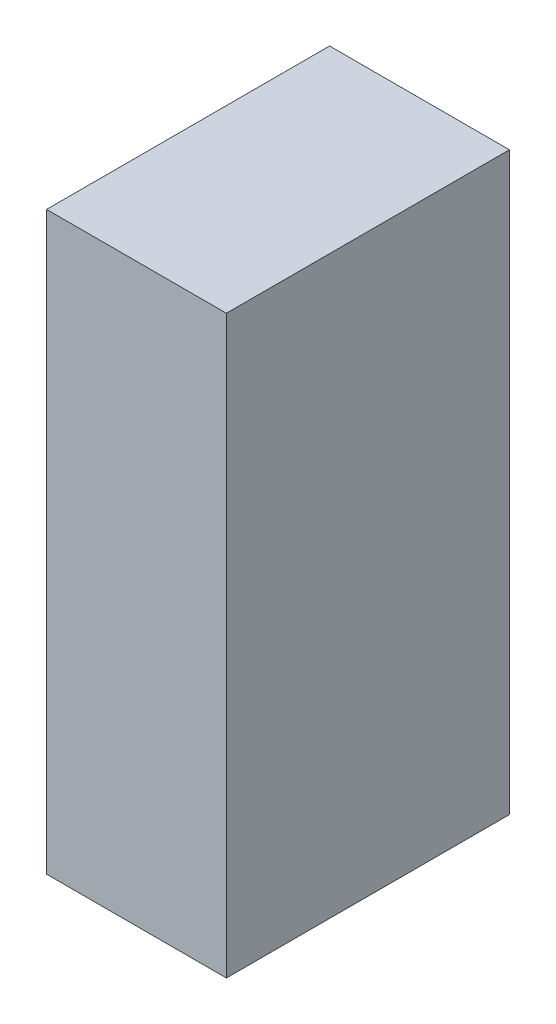
ISO-10303-21;
HEADER;
FILE_DESCRIPTION(('STEP AP214'),'2;1');
FILE_NAME('part.step','',(''),(''),'','','');
FILE_SCHEMA(('AUTOMOTIVE_DESIGN { 1 0 10303 214 1 1 1 1 }'));
ENDSEC;
DATA;
#1=APPLICATION_CONTEXT('core data for automotive mechanical design processes');
#2=APPLICATION_PROTOCOL_DEFINITION('international standard','automotive_design',2000,#1);
#3=PRODUCT_CONTEXT('',#1,'mechanical');
#4=PRODUCT('Part','Part','',(#3));
#5=PRODUCT_RELATED_PRODUCT_CATEGORY('part','',(#4));
#6=PRODUCT_DEFINITION_FORMATION('','',#4);
#7=PRODUCT_DEFINITION_CONTEXT('part definition',#1,'design');
#8=PRODUCT_DEFINITION('design','',#6,#7);
#9=PRODUCT_DEFINITION_SHAPE('','',#8);
#10=(LENGTH_UNIT() NAMED_UNIT(*) SI_UNIT(.MILLI.,.METRE.));
#11=(NAMED_UNIT(*) PLANE_ANGLE_UNIT() SI_UNIT($,.RADIAN.));
#12=(NAMED_UNIT(*) SI_UNIT($,.STERADIAN.) SOLID_ANGLE_UNIT());
#13=UNCERTAINTY_MEASURE_WITH_UNIT(LENGTH_MEASURE(1.E-05),#10,'distance_accuracy_value','');
#14=(GEOMETRIC_REPRESENTATION_CONTEXT(3) GLOBAL_UNCERTAINTY_ASSIGNED_CONTEXT((#13)) GLOBAL_UNIT_ASSIGNED_CONTEXT((#10,
#11,#12)) REPRESENTATION_CONTEXT('',''));
#15=CARTESIAN_POINT('',(0.,0.,0.));
#16=DIRECTION('',(0.,0.,1.));
#17=DIRECTION('',(1.,0.,0.));
#18=AXIS2_PLACEMENT_3D('',#15,#16,#17);
#19=CARTESIAN_POINT('',(-31.1430000000156,27.2313800000049,3.89916));
#20=DIRECTION('',(0.,0.,1.));
#21=DIRECTION('',(1.,-5.10347319959692E-12,0.));
#22=AXIS2_PLACEMENT_3D('',#19,#20,#21);
#23=PLANE('',#22);
#24=DIRECTION('',(1.,-5.10347319959692E-12,0.));
#25=VECTOR('',#24,1.);
#26=CARTESIAN_POINT('',(-31.1430000000156,27.2313800000049,3.89916));
#27=LINE('',#26,#25);
#28=CARTESIAN_POINT('',(-31.1430000000156,27.2313800000049,3.89916));
#29=VERTEX_POINT('',#28);
#30=CARTESIAN_POINT('',(-29.2390000000156,27.2313799999952,3.89916));
#31=VERTEX_POINT('',#30);
#32=EDGE_CURVE('E80',#29,#31,#27,.T.);
#33=ORIENTED_EDGE('',*,*,#32,.T.);
#34=DIRECTION('',(5.10347319959692E-12,1.,0.));
#35=VECTOR('',#34,1.);
#36=CARTESIAN_POINT('',(-29.2390000000156,27.2313799999952,3.89916));
#37=LINE('',#36,#35);
#38=CARTESIAN_POINT('',(-29.2389999999845,33.3273799999952,3.89916));
#39=VERTEX_POINT('',#38);
#40=EDGE_CURVE('E95',#31,#39,#37,.T.);
#41=ORIENTED_EDGE('',*,*,#40,.T.);
#42=DIRECTION('',(-1.,5.10347319959692E-12,0.));
#43=VECTOR('',#42,1.);
#44=CARTESIAN_POINT('',(-29.2389999999845,33.3273799999952,3.89916));
#45=LINE('',#44,#43);
#46=CARTESIAN_POINT('',(-31.1429999999845,33.3273800000048,3.89916));
#47=VERTEX_POINT('',#46);
#48=EDGE_CURVE('E72',#39,#47,#45,.T.);
#49=ORIENTED_EDGE('',*,*,#48,.T.);
#50=DIRECTION('',(-5.10347319959692E-12,-1.,0.));
#51=VECTOR('',#50,1.);
#52=CARTESIAN_POINT('',(-31.1429999999845,33.3273800000048,3.89916));
#53=LINE('',#52,#51);
#54=EDGE_CURVE('E11',#47,#29,#53,.T.);
#55=ORIENTED_EDGE('',*,*,#54,.T.);
#56=EDGE_LOOP('',(#33,#41,#49,#55));
#57=FACE_BOUND('',#56,.T.);
#58=ADVANCED_FACE('F16',(#57),#23,.T.);
#59=CARTESIAN_POINT('',(-31.1429999999845,33.3273800000048,0.90216));
#60=DIRECTION('',(0.,0.,-1.));
#61=DIRECTION('',(-5.10347319959692E-12,-1.,0.));
#62=AXIS2_PLACEMENT_3D('',#59,#60,#61);
#63=PLANE('',#62);
#64=DIRECTION('',(1.,-5.10347319959692E-12,0.));
#65=VECTOR('',#64,1.);
#66=CARTESIAN_POINT('',(-31.1429999999845,33.3273800000048,0.90216));
#67=LINE('',#66,#65);
#68=CARTESIAN_POINT('',(-31.1429999999845,33.3273800000048,0.90216));
#69=VERTEX_POINT('',#68);
#70=CARTESIAN_POINT('',(-29.2389999999845,33.3273799999952,0.90216));
#71=VERTEX_POINT('',#70);
#72=EDGE_CURVE('E98',#69,#71,#67,.T.);
#73=ORIENTED_EDGE('',*,*,#72,.T.);
#74=DIRECTION('',(-5.10347319959692E-12,-1.,0.));
#75=VECTOR('',#74,1.);
#76=CARTESIAN_POINT('',(-29.2389999999845,33.3273799999952,0.90216));
#77=LINE('',#76,#75);
#78=CARTESIAN_POINT('',(-29.2390000000156,27.2313799999952,0.90216));
#79=VERTEX_POINT('',#78);
#80=EDGE_CURVE('E20',#71,#79,#77,.T.);
#81=ORIENTED_EDGE('',*,*,#80,.T.);
#82=DIRECTION('',(-1.,5.10347319959692E-12,0.));
#83=VECTOR('',#82,1.);
#84=CARTESIAN_POINT('',(-29.2390000000156,27.2313799999952,0.90216));
#85=LINE('',#84,#83);
#86=CARTESIAN_POINT('',(-31.1430000000156,27.2313800000049,0.90216));
#87=VERTEX_POINT('',#86);
#88=EDGE_CURVE('E78',#79,#87,#85,.T.);
#89=ORIENTED_EDGE('',*,*,#88,.T.);
#90=DIRECTION('',(5.10347319959692E-12,1.,0.));
#91=VECTOR('',#90,1.);
#92=CARTESIAN_POINT('',(-31.1430000000156,27.2313800000049,0.90216));
#93=LINE('',#92,#91);
#94=EDGE_CURVE('E27',#87,#69,#93,.T.);
#95=ORIENTED_EDGE('',*,*,#94,.T.);
#96=EDGE_LOOP('',(#73,#81,#89,#95));
#97=FACE_BOUND('',#96,.T.);
#98=ADVANCED_FACE('F83',(#97),#63,.T.);
#99=CARTESIAN_POINT('',(-31.1429999999845,33.3273800000048,0.90216));
#100=DIRECTION('',(-1.,5.10347319959692E-12,0.));
#101=DIRECTION('',(0.,0.,1.));
#102=AXIS2_PLACEMENT_3D('',#99,#100,#101);
#103=PLANE('',#102);
#104=ORIENTED_EDGE('',*,*,#94,.F.);
#105=DIRECTION('',(0.,0.,1.));
#106=VECTOR('',#105,1.);
#107=CARTESIAN_POINT('',(-31.1430000000156,27.2313800000049,0.90216));
#108=LINE('',#107,#106);
#109=EDGE_CURVE('E64',#87,#29,#108,.T.);
#110=ORIENTED_EDGE('',*,*,#109,.T.);
#111=ORIENTED_EDGE('',*,*,#54,.F.);
#112=DIRECTION('',(0.,0.,-1.));
#113=VECTOR('',#112,1.);
#114=CARTESIAN_POINT('',(-31.1429999999845,33.3273800000048,3.89916));
#115=LINE('',#114,#113);
#116=EDGE_CURVE('E67',#47,#69,#115,.T.);
#117=ORIENTED_EDGE('',*,*,#116,.T.);
#118=EDGE_LOOP('',(#104,#110,#111,#117));
#119=FACE_BOUND('',#118,.T.);
#120=ADVANCED_FACE('F63',(#119),#103,.T.);
#121=CARTESIAN_POINT('',(-29.2389999999845,33.3273799999952,0.90216));
#122=DIRECTION('',(5.10347319959692E-12,1.,0.));
#123=DIRECTION('',(1.,-5.10347319959692E-12,0.));
#124=AXIS2_PLACEMENT_3D('',#121,#122,#123);
#125=PLANE('',#124);
#126=ORIENTED_EDGE('',*,*,#72,.F.);
#127=ORIENTED_EDGE('',*,*,#116,.F.);
#128=ORIENTED_EDGE('',*,*,#48,.F.);
#129=DIRECTION('',(0.,0.,-1.));
#130=VECTOR('',#129,1.);
#131=CARTESIAN_POINT('',(-29.2389999999845,33.3273799999952,3.89916));
#132=LINE('',#131,#130);
#133=EDGE_CURVE('E99',#39,#71,#132,.T.);
#134=ORIENTED_EDGE('',*,*,#133,.T.);
#135=EDGE_LOOP('',(#126,#127,#128,#134));
#136=FACE_BOUND('',#135,.T.);
#137=ADVANCED_FACE('F18',(#136),#125,.T.);
#138=CARTESIAN_POINT('',(-29.2390000000156,27.2313799999952,0.90216));
#139=DIRECTION('',(1.,-5.10347319959692E-12,0.));
#140=DIRECTION('',(5.10347319959692E-12,1.,0.));
#141=AXIS2_PLACEMENT_3D('',#138,#139,#140);
#142=PLANE('',#141);
#143=ORIENTED_EDGE('',*,*,#80,.F.);
#144=ORIENTED_EDGE('',*,*,#133,.F.);
#145=ORIENTED_EDGE('',*,*,#40,.F.);
#146=DIRECTION('',(0.,0.,-1.));
#147=VECTOR('',#146,1.);
#148=CARTESIAN_POINT('',(-29.2390000000156,27.2313799999952,3.89916));
#149=LINE('',#148,#147);
#150=EDGE_CURVE('E87',#31,#79,#149,.T.);
#151=ORIENTED_EDGE('',*,*,#150,.T.);
#152=EDGE_LOOP('',(#143,#144,#145,#151));
#153=FACE_BOUND('',#152,.T.);
#154=ADVANCED_FACE('F114',(#153),#142,.T.);
#155=CARTESIAN_POINT('',(-31.1430000000156,27.2313800000049,0.90216));
#156=DIRECTION('',(-5.10347319959692E-12,-1.,0.));
#157=DIRECTION('',(0.,0.,-1.));
#158=AXIS2_PLACEMENT_3D('',#155,#156,#157);
#159=PLANE('',#158);
#160=ORIENTED_EDGE('',*,*,#88,.F.);
#161=ORIENTED_EDGE('',*,*,#150,.F.);
#162=ORIENTED_EDGE('',*,*,#32,.F.);
#163=ORIENTED_EDGE('',*,*,#109,.F.);
#164=EDGE_LOOP('',(#160,#161,#162,#163));
#165=FACE_BOUND('',#164,.T.);
#166=ADVANCED_FACE('F76',(#165),#159,.T.);
#167=CLOSED_SHELL('',(#58,#98,#120,#137,#154,#166));
#168=MANIFOLD_SOLID_BREP('B1',#167);
#169=ADVANCED_BREP_SHAPE_REPRESENTATION('',(#18,#168),#14);
#170=SHAPE_DEFINITION_REPRESENTATION(#9,#169);
ENDSEC;
END-ISO-10303-21;
